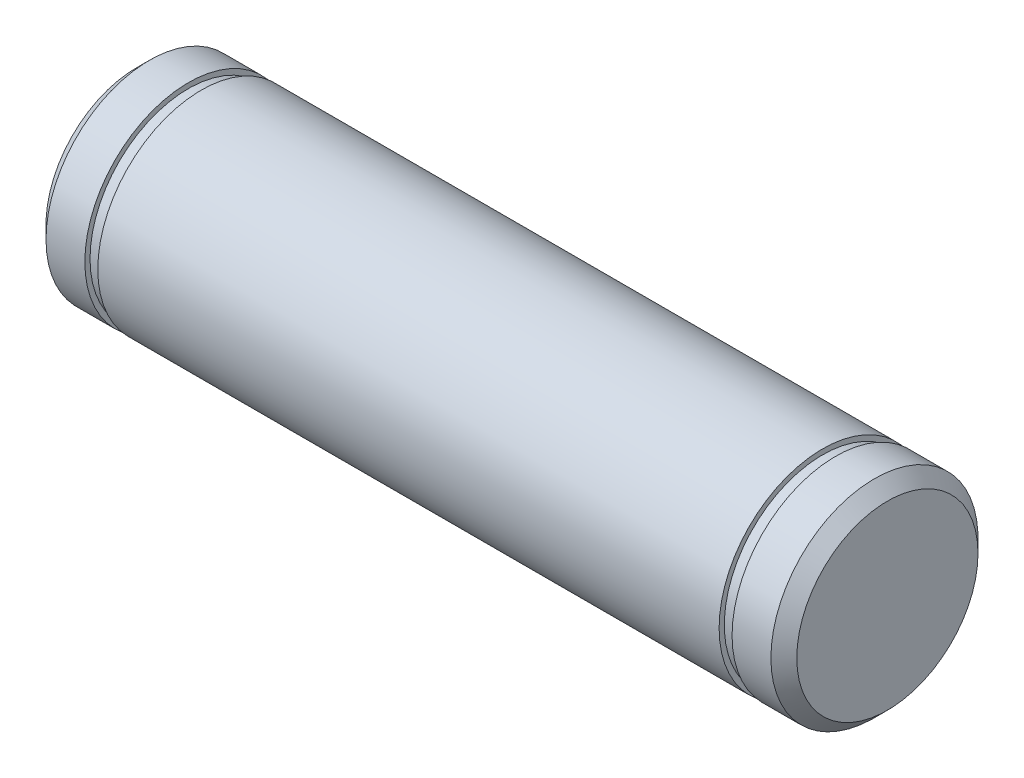
ISO-10303-21;
HEADER;
FILE_DESCRIPTION(('STEP AP214'),'2;1');
FILE_NAME('part.step','',(''),(''),'','','');
FILE_SCHEMA(('AUTOMOTIVE_DESIGN { 1 0 10303 214 1 1 1 1 }'));
ENDSEC;
DATA;
#1=APPLICATION_CONTEXT('core data for automotive mechanical design processes');
#2=APPLICATION_PROTOCOL_DEFINITION('international standard','automotive_design',2000,#1);
#3=PRODUCT_CONTEXT('',#1,'mechanical');
#4=PRODUCT('Part','Part','',(#3));
#5=PRODUCT_RELATED_PRODUCT_CATEGORY('part','',(#4));
#6=PRODUCT_DEFINITION_FORMATION('','',#4);
#7=PRODUCT_DEFINITION_CONTEXT('part definition',#1,'design');
#8=PRODUCT_DEFINITION('design','',#6,#7);
#9=PRODUCT_DEFINITION_SHAPE('','',#8);
#10=(LENGTH_UNIT() NAMED_UNIT(*) SI_UNIT(.MILLI.,.METRE.));
#11=(NAMED_UNIT(*) PLANE_ANGLE_UNIT() SI_UNIT($,.RADIAN.));
#12=(NAMED_UNIT(*) SI_UNIT($,.STERADIAN.) SOLID_ANGLE_UNIT());
#13=UNCERTAINTY_MEASURE_WITH_UNIT(LENGTH_MEASURE(1.E-05),#10,'distance_accuracy_value','');
#14=(GEOMETRIC_REPRESENTATION_CONTEXT(3) GLOBAL_UNCERTAINTY_ASSIGNED_CONTEXT((#13)) GLOBAL_UNIT_ASSIGNED_CONTEXT((#10,
#11,#12)) REPRESENTATION_CONTEXT('',''));
#15=CARTESIAN_POINT('',(0.,0.,0.));
#16=DIRECTION('',(0.,0.,1.));
#17=DIRECTION('',(1.,0.,0.));
#18=AXIS2_PLACEMENT_3D('',#15,#16,#17);
#19=CARTESIAN_POINT('',(14.5,0.,0.));
#20=DIRECTION('',(-1.,0.,0.));
#21=DIRECTION('',(0.,0.,1.));
#22=AXIS2_PLACEMENT_3D('',#19,#20,#21);
#23=CYLINDRICAL_SURFACE('',#22,2.);
#24=CARTESIAN_POINT('',(13.25,0.,0.));
#25=DIRECTION('',(1.,0.,0.));
#26=DIRECTION('',(0.,0.,-1.));
#27=AXIS2_PLACEMENT_3D('',#24,#25,#26);
#28=CIRCLE('',#27,2.);
#29=CARTESIAN_POINT('',(13.25,0.,2.));
#30=VERTEX_POINT('',#29);
#31=EDGE_CURVE('E56',#30,#30,#28,.T.);
#32=CARTESIAN_POINT('',(1.25,0.,0.));
#33=DIRECTION('',(-1.,0.,0.));
#34=DIRECTION('',(0.,0.,1.));
#35=AXIS2_PLACEMENT_3D('',#32,#33,#34);
#36=CIRCLE('',#35,2.);
#37=CARTESIAN_POINT('',(1.25,0.,2.));
#38=VERTEX_POINT('',#37);
#39=EDGE_CURVE('E57',#38,#38,#36,.T.);
#40=CARTESIAN_POINT('',(13.25,0.,2.));
#41=CARTESIAN_POINT('',(13.125,0.,2.));
#42=CARTESIAN_POINT('',(13.,0.,2.));
#43=CARTESIAN_POINT('',(12.75,0.,2.));
#44=CARTESIAN_POINT('',(12.625,0.,2.));
#45=CARTESIAN_POINT('',(12.375,0.,2.));
#46=CARTESIAN_POINT('',(12.25,0.,2.));
#47=CARTESIAN_POINT('',(12.,0.,2.));
#48=CARTESIAN_POINT('',(11.875,0.,2.));
#49=CARTESIAN_POINT('',(11.625,0.,2.));
#50=CARTESIAN_POINT('',(11.5,0.,2.));
#51=CARTESIAN_POINT('',(11.25,0.,2.));
#52=CARTESIAN_POINT('',(11.125,0.,2.));
#53=CARTESIAN_POINT('',(10.875,0.,2.));
#54=CARTESIAN_POINT('',(10.75,0.,2.));
#55=CARTESIAN_POINT('',(10.5,0.,2.));
#56=CARTESIAN_POINT('',(10.375,0.,2.));
#57=CARTESIAN_POINT('',(10.125,0.,2.));
#58=CARTESIAN_POINT('',(10.,0.,2.));
#59=CARTESIAN_POINT('',(9.75,0.,2.));
#60=CARTESIAN_POINT('',(9.625,0.,2.));
#61=CARTESIAN_POINT('',(9.375,0.,2.));
#62=CARTESIAN_POINT('',(9.25,0.,2.));
#63=CARTESIAN_POINT('',(9.,0.,2.));
#64=CARTESIAN_POINT('',(8.875,0.,2.));
#65=CARTESIAN_POINT('',(8.625,0.,2.));
#66=CARTESIAN_POINT('',(8.5,0.,2.));
#67=CARTESIAN_POINT('',(8.25,0.,2.));
#68=CARTESIAN_POINT('',(8.125,0.,2.));
#69=CARTESIAN_POINT('',(7.875,0.,2.));
#70=CARTESIAN_POINT('',(7.75,0.,2.));
#71=CARTESIAN_POINT('',(7.5,0.,2.));
#72=CARTESIAN_POINT('',(7.375,0.,2.));
#73=CARTESIAN_POINT('',(7.125,0.,2.));
#74=CARTESIAN_POINT('',(7.,0.,2.));
#75=CARTESIAN_POINT('',(6.75,0.,2.));
#76=CARTESIAN_POINT('',(6.625,0.,2.));
#77=CARTESIAN_POINT('',(6.375,0.,2.));
#78=CARTESIAN_POINT('',(6.25,0.,2.));
#79=CARTESIAN_POINT('',(6.,0.,2.));
#80=CARTESIAN_POINT('',(5.875,0.,2.));
#81=CARTESIAN_POINT('',(5.625,0.,2.));
#82=CARTESIAN_POINT('',(5.5,0.,2.));
#83=CARTESIAN_POINT('',(5.25,0.,2.));
#84=CARTESIAN_POINT('',(5.125,0.,2.));
#85=CARTESIAN_POINT('',(4.875,0.,2.));
#86=CARTESIAN_POINT('',(4.75,0.,2.));
#87=CARTESIAN_POINT('',(4.5,0.,2.));
#88=CARTESIAN_POINT('',(4.375,0.,2.));
#89=CARTESIAN_POINT('',(4.125,0.,2.));
#90=CARTESIAN_POINT('',(4.,0.,2.));
#91=CARTESIAN_POINT('',(3.75,0.,2.));
#92=CARTESIAN_POINT('',(3.625,0.,2.));
#93=CARTESIAN_POINT('',(3.375,0.,2.));
#94=CARTESIAN_POINT('',(3.25,0.,2.));
#95=CARTESIAN_POINT('',(3.,0.,2.));
#96=CARTESIAN_POINT('',(2.875,0.,2.));
#97=CARTESIAN_POINT('',(2.625,0.,2.));
#98=CARTESIAN_POINT('',(2.5,0.,2.));
#99=CARTESIAN_POINT('',(2.25,0.,2.));
#100=CARTESIAN_POINT('',(2.125,0.,2.));
#101=CARTESIAN_POINT('',(1.875,0.,2.));
#102=CARTESIAN_POINT('',(1.75,0.,2.));
#103=CARTESIAN_POINT('',(1.5,0.,2.));
#104=CARTESIAN_POINT('',(1.375,0.,2.));
#105=CARTESIAN_POINT('',(1.25,0.,2.));
#106=B_SPLINE_CURVE_WITH_KNOTS('',3,(#40,#41,#42,#43,#44,#45,#46,#47,#48,#49,#50,#51,#52,#53,
#54,#55,#56,#57,#58,#59,#60,#61,#62,#63,#64,#65,#66,#67,#68,#69,#70,#71,#72,#73,#74,#75,#76,#77,
#78,#79,#80,#81,#82,#83,#84,#85,#86,#87,#88,#89,#90,#91,#92,#93,#94,#95,#96,#97,#98,#99,#100,
#101,#102,#103,#104,#105),.UNSPECIFIED.,.F.,.F.,(4,2,2,2,2,2,2,2,2,2,2,2,2,2,2,2,2,2,2,2,2,2,2,
2,2,2,2,2,2,2,2,2,4),(0.,0.374999999999999,0.749999999999999,1.125,1.5,1.875,2.25,2.625,3.,
3.375,3.75,4.125,4.5,4.875,5.25,5.625,6.,6.375,6.75,7.125,7.5,7.875,8.25,8.625,9.,9.375,9.75,
10.125,10.5,10.875,11.25,11.625,12.),.UNSPECIFIED.);
#107=EDGE_CURVE('BSEAM36',#30,#38,#106,.T.);
#108=ORIENTED_EDGE('',*,*,#31,.F.);
#109=ORIENTED_EDGE('',*,*,#39,.F.);
#110=ORIENTED_EDGE('',*,*,#107,.T.);
#111=ORIENTED_EDGE('',*,*,#107,.F.);
#112=EDGE_LOOP('',(#108,#110,#109,#111));
#113=FACE_BOUND('',#112,.T.);
#114=ADVANCED_FACE('F36',(#113),#23,.T.);
#115=CARTESIAN_POINT('',(13.25,0.,0.));
#116=DIRECTION('',(1.,0.,0.));
#117=DIRECTION('',(0.,0.,-1.));
#118=AXIS2_PLACEMENT_3D('',#115,#116,#117);
#119=PLANE('',#118);
#120=CARTESIAN_POINT('',(13.25,0.,0.));
#121=DIRECTION('',(1.,0.,0.));
#122=DIRECTION('',(0.,0.,-1.));
#123=AXIS2_PLACEMENT_3D('',#120,#121,#122);
#124=CIRCLE('',#123,1.9);
#125=CARTESIAN_POINT('',(13.25,0.,-1.9));
#126=VERTEX_POINT('',#125);
#127=EDGE_CURVE('E70',#126,#126,#124,.T.);
#128=ORIENTED_EDGE('',*,*,#127,.F.);
#129=EDGE_LOOP('',(#128));
#130=FACE_BOUND('',#129,.T.);
#131=ORIENTED_EDGE('',*,*,#31,.T.);
#132=EDGE_LOOP('',(#131));
#133=FACE_BOUND('',#132,.T.);
#134=ADVANCED_FACE('F93',(#130,#133),#119,.T.);
#135=CARTESIAN_POINT('',(13.5,0.,0.));
#136=DIRECTION('',(1.,0.,0.));
#137=DIRECTION('',(0.,0.,-1.));
#138=AXIS2_PLACEMENT_3D('',#135,#136,#137);
#139=PLANE('',#138);
#140=CARTESIAN_POINT('',(13.5,0.,0.));
#141=DIRECTION('',(1.,0.,0.));
#142=DIRECTION('',(0.,0.,-1.));
#143=AXIS2_PLACEMENT_3D('',#140,#141,#142);
#144=CIRCLE('',#143,1.9);
#145=CARTESIAN_POINT('',(13.5,0.,-1.9));
#146=VERTEX_POINT('',#145);
#147=EDGE_CURVE('E60',#146,#146,#144,.T.);
#148=ORIENTED_EDGE('',*,*,#147,.T.);
#149=EDGE_LOOP('',(#148));
#150=FACE_BOUND('',#149,.T.);
#151=CARTESIAN_POINT('',(13.5,0.,0.));
#152=DIRECTION('',(1.,0.,0.));
#153=DIRECTION('',(0.,0.,-1.));
#154=AXIS2_PLACEMENT_3D('',#151,#152,#153);
#155=CIRCLE('',#154,2.);
#156=CARTESIAN_POINT('',(13.5,0.,2.));
#157=VERTEX_POINT('',#156);
#158=EDGE_CURVE('E67',#157,#157,#155,.T.);
#159=ORIENTED_EDGE('',*,*,#158,.F.);
#160=EDGE_LOOP('',(#159));
#161=FACE_BOUND('',#160,.T.);
#162=ADVANCED_FACE('F100',(#150,#161),#139,.F.);
#163=CARTESIAN_POINT('',(13.25,0.,0.));
#164=DIRECTION('',(1.,0.,0.));
#165=DIRECTION('',(0.,0.,-1.));
#166=AXIS2_PLACEMENT_3D('',#163,#164,#165);
#167=CYLINDRICAL_SURFACE('',#166,1.9);
#168=ORIENTED_EDGE('',*,*,#127,.T.);
#169=EDGE_LOOP('',(#168));
#170=FACE_BOUND('',#169,.T.);
#171=ORIENTED_EDGE('',*,*,#147,.F.);
#172=EDGE_LOOP('',(#171));
#173=FACE_BOUND('',#172,.T.);
#174=ADVANCED_FACE('F114',(#170,#173),#167,.T.);
#175=CARTESIAN_POINT('',(14.5,0.,0.));
#176=DIRECTION('',(1.,0.,0.));
#177=DIRECTION('',(0.,0.,-1.));
#178=AXIS2_PLACEMENT_3D('',#175,#176,#177);
#179=PLANE('',#178);
#180=CARTESIAN_POINT('',(14.5,0.,0.));
#181=DIRECTION('',(1.,0.,0.));
#182=DIRECTION('',(0.,0.,-1.));
#183=AXIS2_PLACEMENT_3D('',#180,#181,#182);
#184=CIRCLE('',#183,1.75000000000001);
#185=CARTESIAN_POINT('',(14.5,0.,-1.75000000000001));
#186=VERTEX_POINT('',#185);
#187=EDGE_CURVE('E51',#186,#186,#184,.T.);
#188=ORIENTED_EDGE('',*,*,#187,.T.);
#189=EDGE_LOOP('',(#188));
#190=FACE_BOUND('',#189,.T.);
#191=ADVANCED_FACE('F109',(#190),#179,.T.);
#192=CARTESIAN_POINT('',(14.25,0.,0.));
#193=DIRECTION('',(1.,0.,0.));
#194=DIRECTION('',(0.,0.,-1.));
#195=AXIS2_PLACEMENT_3D('',#192,#193,#194);
#196=CIRCLE('',#195,2.);
#197=CARTESIAN_POINT('',(14.25,0.,2.));
#198=VERTEX_POINT('',#197);
#199=EDGE_CURVE('E47',#198,#198,#196,.F.);
#200=CARTESIAN_POINT('',(14.25,0.,2.));
#201=CARTESIAN_POINT('',(14.2421875,0.,2.));
#202=CARTESIAN_POINT('',(14.234375,0.,2.));
#203=CARTESIAN_POINT('',(14.21875,0.,2.));
#204=CARTESIAN_POINT('',(14.2109375,0.,2.));
#205=CARTESIAN_POINT('',(14.1953125,0.,2.));
#206=CARTESIAN_POINT('',(14.1875,0.,2.));
#207=CARTESIAN_POINT('',(14.171875,0.,2.));
#208=CARTESIAN_POINT('',(14.1640625,0.,2.));
#209=CARTESIAN_POINT('',(14.1484375,0.,2.));
#210=CARTESIAN_POINT('',(14.140625,0.,2.));
#211=CARTESIAN_POINT('',(14.125,0.,2.));
#212=CARTESIAN_POINT('',(14.1171875,0.,2.));
#213=CARTESIAN_POINT('',(14.1015625,0.,2.));
#214=CARTESIAN_POINT('',(14.09375,0.,2.));
#215=CARTESIAN_POINT('',(14.078125,0.,2.));
#216=CARTESIAN_POINT('',(14.0703125,0.,2.));
#217=CARTESIAN_POINT('',(14.0546875,0.,2.));
#218=CARTESIAN_POINT('',(14.046875,0.,2.));
#219=CARTESIAN_POINT('',(14.03125,0.,2.));
#220=CARTESIAN_POINT('',(14.0234375,0.,2.));
#221=CARTESIAN_POINT('',(14.0078125,0.,2.));
#222=CARTESIAN_POINT('',(14.,0.,2.));
#223=CARTESIAN_POINT('',(13.984375,0.,2.));
#224=CARTESIAN_POINT('',(13.9765625,0.,2.));
#225=CARTESIAN_POINT('',(13.9609375,0.,2.));
#226=CARTESIAN_POINT('',(13.953125,0.,2.));
#227=CARTESIAN_POINT('',(13.9375,0.,2.));
#228=CARTESIAN_POINT('',(13.9296875,0.,2.));
#229=CARTESIAN_POINT('',(13.9140625,0.,2.));
#230=CARTESIAN_POINT('',(13.90625,0.,2.));
#231=CARTESIAN_POINT('',(13.890625,0.,2.));
#232=CARTESIAN_POINT('',(13.8828125,0.,2.));
#233=CARTESIAN_POINT('',(13.8671875,0.,2.));
#234=CARTESIAN_POINT('',(13.859375,0.,2.));
#235=CARTESIAN_POINT('',(13.84375,0.,2.));
#236=CARTESIAN_POINT('',(13.8359375,0.,2.));
#237=CARTESIAN_POINT('',(13.8203125,0.,2.));
#238=CARTESIAN_POINT('',(13.8125,0.,2.));
#239=CARTESIAN_POINT('',(13.796875,0.,2.));
#240=CARTESIAN_POINT('',(13.7890625,0.,2.));
#241=CARTESIAN_POINT('',(13.7734375,0.,2.));
#242=CARTESIAN_POINT('',(13.765625,0.,2.));
#243=CARTESIAN_POINT('',(13.75,0.,2.));
#244=CARTESIAN_POINT('',(13.7421875,0.,2.));
#245=CARTESIAN_POINT('',(13.7265625,0.,2.));
#246=CARTESIAN_POINT('',(13.71875,0.,2.));
#247=CARTESIAN_POINT('',(13.703125,0.,2.));
#248=CARTESIAN_POINT('',(13.6953125,0.,2.));
#249=CARTESIAN_POINT('',(13.6796875,0.,2.));
#250=CARTESIAN_POINT('',(13.671875,0.,2.));
#251=CARTESIAN_POINT('',(13.65625,0.,2.));
#252=CARTESIAN_POINT('',(13.6484375,0.,2.));
#253=CARTESIAN_POINT('',(13.6328125,0.,2.));
#254=CARTESIAN_POINT('',(13.625,0.,2.));
#255=CARTESIAN_POINT('',(13.609375,0.,2.));
#256=CARTESIAN_POINT('',(13.6015625,0.,2.));
#257=CARTESIAN_POINT('',(13.5859375,0.,2.));
#258=CARTESIAN_POINT('',(13.578125,0.,2.));
#259=CARTESIAN_POINT('',(13.5625,0.,2.));
#260=CARTESIAN_POINT('',(13.5546875,0.,2.));
#261=CARTESIAN_POINT('',(13.5390625,0.,2.));
#262=CARTESIAN_POINT('',(13.53125,0.,2.));
#263=CARTESIAN_POINT('',(13.515625,0.,2.));
#264=CARTESIAN_POINT('',(13.5078125,0.,2.));
#265=CARTESIAN_POINT('',(13.5,0.,2.));
#266=B_SPLINE_CURVE_WITH_KNOTS('',3,(#200,#201,#202,#203,#204,#205,#206,#207,#208,#209,#210,
#211,#212,#213,#214,#215,#216,#217,#218,#219,#220,#221,#222,#223,#224,#225,#226,#227,#228,#229,
#230,#231,#232,#233,#234,#235,#236,#237,#238,#239,#240,#241,#242,#243,#244,#245,#246,#247,#248,
#249,#250,#251,#252,#253,#254,#255,#256,#257,#258,#259,#260,#261,#262,#263,#264,#265),
.UNSPECIFIED.,.F.,.F.,(4,2,2,2,2,2,2,2,2,2,2,2,2,2,2,2,2,2,2,2,2,2,2,2,2,2,2,2,2,2,2,2,4),(0.,
0.0234374999999992,0.046875,0.0703124999999992,0.0937500000000001,0.117187500000001,0.140625,
0.164062500000001,0.187500000000002,0.210937500000001,0.234375000000002,0.257812500000001,
0.281250000000002,0.304687500000003,0.328125000000002,0.351562500000003,0.375000000000004,
0.398437500000003,0.421875000000004,0.445312500000005,0.468750000000004,0.492187500000005,
0.515625000000004,0.539062500000005,0.562500000000006,0.585937500000005,0.609375000000006,
0.632812500000007,0.656250000000006,0.679687500000007,0.703125000000006,0.726562500000007,
0.750000000000008),.UNSPECIFIED.);
#267=EDGE_CURVE('BSEAM88',#198,#157,#266,.T.);
#268=ORIENTED_EDGE('',*,*,#199,.T.);
#269=ORIENTED_EDGE('',*,*,#158,.T.);
#270=ORIENTED_EDGE('',*,*,#267,.T.);
#271=ORIENTED_EDGE('',*,*,#267,.F.);
#272=EDGE_LOOP('',(#268,#270,#269,#271));
#273=FACE_BOUND('',#272,.T.);
#274=ADVANCED_FACE('F88',(#273),#23,.T.);
#275=CARTESIAN_POINT('',(1.25,0.,0.));
#276=DIRECTION('',(-1.,0.,0.));
#277=DIRECTION('',(0.,0.,1.));
#278=AXIS2_PLACEMENT_3D('',#275,#276,#277);
#279=PLANE('',#278);
#280=CARTESIAN_POINT('',(1.25,0.,0.));
#281=DIRECTION('',(-1.,0.,0.));
#282=DIRECTION('',(0.,0.,1.));
#283=AXIS2_PLACEMENT_3D('',#280,#281,#282);
#284=CIRCLE('',#283,1.9);
#285=CARTESIAN_POINT('',(1.25,0.,1.9));
#286=VERTEX_POINT('',#285);
#287=EDGE_CURVE('E64',#286,#286,#284,.T.);
#288=ORIENTED_EDGE('',*,*,#287,.F.);
#289=EDGE_LOOP('',(#288));
#290=FACE_BOUND('',#289,.T.);
#291=ORIENTED_EDGE('',*,*,#39,.T.);
#292=EDGE_LOOP('',(#291));
#293=FACE_BOUND('',#292,.T.);
#294=ADVANCED_FACE('F84',(#290,#293),#279,.T.);
#295=CARTESIAN_POINT('',(1.,0.,0.));
#296=DIRECTION('',(-1.,0.,0.));
#297=DIRECTION('',(0.,0.,1.));
#298=AXIS2_PLACEMENT_3D('',#295,#296,#297);
#299=PLANE('',#298);
#300=CARTESIAN_POINT('',(1.,0.,0.));
#301=DIRECTION('',(-1.,0.,0.));
#302=DIRECTION('',(0.,0.,1.));
#303=AXIS2_PLACEMENT_3D('',#300,#301,#302);
#304=CIRCLE('',#303,1.9);
#305=CARTESIAN_POINT('',(1.,0.,1.9));
#306=VERTEX_POINT('',#305);
#307=EDGE_CURVE('E75',#306,#306,#304,.T.);
#308=ORIENTED_EDGE('',*,*,#307,.T.);
#309=EDGE_LOOP('',(#308));
#310=FACE_BOUND('',#309,.T.);
#311=CARTESIAN_POINT('',(0.999999999999999,0.,0.));
#312=DIRECTION('',(-1.,0.,0.));
#313=DIRECTION('',(0.,0.,1.));
#314=AXIS2_PLACEMENT_3D('',#311,#312,#313);
#315=CIRCLE('',#314,2.);
#316=CARTESIAN_POINT('',(1.,0.,2.));
#317=VERTEX_POINT('',#316);
#318=EDGE_CURVE('E61',#317,#317,#315,.T.);
#319=ORIENTED_EDGE('',*,*,#318,.F.);
#320=EDGE_LOOP('',(#319));
#321=FACE_BOUND('',#320,.T.);
#322=ADVANCED_FACE('F87',(#310,#321),#299,.F.);
#323=CARTESIAN_POINT('',(1.25,0.,0.));
#324=DIRECTION('',(-1.,0.,0.));
#325=DIRECTION('',(0.,0.,1.));
#326=AXIS2_PLACEMENT_3D('',#323,#324,#325);
#327=CYLINDRICAL_SURFACE('',#326,1.9);
#328=ORIENTED_EDGE('',*,*,#287,.T.);
#329=EDGE_LOOP('',(#328));
#330=FACE_BOUND('',#329,.T.);
#331=ORIENTED_EDGE('',*,*,#307,.F.);
#332=EDGE_LOOP('',(#331));
#333=FACE_BOUND('',#332,.T.);
#334=ADVANCED_FACE('F81',(#330,#333),#327,.T.);
#335=CARTESIAN_POINT('',(0.,0.,0.));
#336=DIRECTION('',(1.,0.,0.));
#337=DIRECTION('',(0.,0.,-1.));
#338=AXIS2_PLACEMENT_3D('',#335,#336,#337);
#339=PLANE('',#338);
#340=CARTESIAN_POINT('',(0.,0.,0.));
#341=DIRECTION('',(1.,0.,0.));
#342=DIRECTION('',(0.,0.,-1.));
#343=AXIS2_PLACEMENT_3D('',#340,#341,#342);
#344=CIRCLE('',#343,1.74999999999998);
#345=CARTESIAN_POINT('',(0.,0.,-1.74999999999998));
#346=VERTEX_POINT('',#345);
#347=EDGE_CURVE('E10',#346,#346,#344,.F.);
#348=ORIENTED_EDGE('',*,*,#347,.T.);
#349=EDGE_LOOP('',(#348));
#350=FACE_BOUND('',#349,.T.);
#351=ADVANCED_FACE('F107',(#350),#339,.F.);
#352=CARTESIAN_POINT('',(0.250000000000014,0.,0.));
#353=DIRECTION('',(1.,0.,0.));
#354=DIRECTION('',(0.,0.,-1.));
#355=AXIS2_PLACEMENT_3D('',#352,#353,#354);
#356=CIRCLE('',#355,2.);
#357=CARTESIAN_POINT('',(0.250000000000014,0.,2.));
#358=VERTEX_POINT('',#357);
#359=EDGE_CURVE('E43',#358,#358,#356,.T.);
#360=CARTESIAN_POINT('',(0.250000000000014,0.,2.));
#361=CARTESIAN_POINT('',(0.257812500000014,0.,2.));
#362=CARTESIAN_POINT('',(0.265625000000014,0.,2.));
#363=CARTESIAN_POINT('',(0.281250000000013,0.,2.));
#364=CARTESIAN_POINT('',(0.289062500000013,0.,2.));
#365=CARTESIAN_POINT('',(0.304687500000013,0.,2.));
#366=CARTESIAN_POINT('',(0.312500000000013,0.,2.));
#367=CARTESIAN_POINT('',(0.328125000000013,0.,2.));
#368=CARTESIAN_POINT('',(0.335937500000013,0.,2.));
#369=CARTESIAN_POINT('',(0.351562500000012,0.,2.));
#370=CARTESIAN_POINT('',(0.359375000000012,0.,2.));
#371=CARTESIAN_POINT('',(0.375000000000012,0.,2.));
#372=CARTESIAN_POINT('',(0.382812500000012,0.,2.));
#373=CARTESIAN_POINT('',(0.398437500000012,0.,2.));
#374=CARTESIAN_POINT('',(0.406250000000012,0.,2.));
#375=CARTESIAN_POINT('',(0.421875000000011,0.,2.));
#376=CARTESIAN_POINT('',(0.429687500000011,0.,2.));
#377=CARTESIAN_POINT('',(0.445312500000011,0.,2.));
#378=CARTESIAN_POINT('',(0.45312500000001,0.,2.));
#379=CARTESIAN_POINT('',(0.46875000000001,0.,2.));
#380=CARTESIAN_POINT('',(0.476562500000009,0.,2.));
#381=CARTESIAN_POINT('',(0.492187500000009,0.,2.));
#382=CARTESIAN_POINT('',(0.50000000000001,0.,2.));
#383=CARTESIAN_POINT('',(0.51562500000001,0.,2.));
#384=CARTESIAN_POINT('',(0.523437500000009,0.,2.));
#385=CARTESIAN_POINT('',(0.539062500000009,0.,2.));
#386=CARTESIAN_POINT('',(0.546875000000009,0.,2.));
#387=CARTESIAN_POINT('',(0.562500000000009,0.,2.));
#388=CARTESIAN_POINT('',(0.570312500000009,0.,2.));
#389=CARTESIAN_POINT('',(0.585937500000009,0.,2.));
#390=CARTESIAN_POINT('',(0.593750000000009,0.,2.));
#391=CARTESIAN_POINT('',(0.609375000000008,0.,2.));
#392=CARTESIAN_POINT('',(0.617187500000008,0.,2.));
#393=CARTESIAN_POINT('',(0.632812500000007,0.,2.));
#394=CARTESIAN_POINT('',(0.640625000000007,0.,2.));
#395=CARTESIAN_POINT('',(0.656250000000006,0.,2.));
#396=CARTESIAN_POINT('',(0.664062500000006,0.,2.));
#397=CARTESIAN_POINT('',(0.679687500000006,0.,2.));
#398=CARTESIAN_POINT('',(0.687500000000006,0.,2.));
#399=CARTESIAN_POINT('',(0.703125000000006,0.,2.));
#400=CARTESIAN_POINT('',(0.710937500000006,0.,2.));
#401=CARTESIAN_POINT('',(0.726562500000006,0.,2.));
#402=CARTESIAN_POINT('',(0.734375000000005,0.,2.));
#403=CARTESIAN_POINT('',(0.750000000000005,0.,2.));
#404=CARTESIAN_POINT('',(0.757812500000006,0.,2.));
#405=CARTESIAN_POINT('',(0.773437500000006,0.,2.));
#406=CARTESIAN_POINT('',(0.781250000000005,0.,2.));
#407=CARTESIAN_POINT('',(0.796875000000005,0.,2.));
#408=CARTESIAN_POINT('',(0.804687500000005,0.,2.));
#409=CARTESIAN_POINT('',(0.820312500000004,0.,2.));
#410=CARTESIAN_POINT('',(0.828125000000004,0.,2.));
#411=CARTESIAN_POINT('',(0.843750000000003,0.,2.));
#412=CARTESIAN_POINT('',(0.851562500000003,0.,2.));
#413=CARTESIAN_POINT('',(0.867187500000003,0.,2.));
#414=CARTESIAN_POINT('',(0.875000000000003,0.,2.));
#415=CARTESIAN_POINT('',(0.890625000000003,0.,2.));
#416=CARTESIAN_POINT('',(0.898437500000003,0.,2.));
#417=CARTESIAN_POINT('',(0.914062500000002,0.,2.));
#418=CARTESIAN_POINT('',(0.921875000000002,0.,2.));
#419=CARTESIAN_POINT('',(0.937500000000002,0.,2.));
#420=CARTESIAN_POINT('',(0.945312500000002,0.,2.));
#421=CARTESIAN_POINT('',(0.960937500000002,0.,2.));
#422=CARTESIAN_POINT('',(0.968750000000002,0.,2.));
#423=CARTESIAN_POINT('',(0.984375000000002,0.,2.));
#424=CARTESIAN_POINT('',(0.992187500000001,0.,2.));
#425=CARTESIAN_POINT('',(1.,0.,2.));
#426=B_SPLINE_CURVE_WITH_KNOTS('',3,(#360,#361,#362,#363,#364,#365,#366,#367,#368,#369,#370,
#371,#372,#373,#374,#375,#376,#377,#378,#379,#380,#381,#382,#383,#384,#385,#386,#387,#388,#389,
#390,#391,#392,#393,#394,#395,#396,#397,#398,#399,#400,#401,#402,#403,#404,#405,#406,#407,#408,
#409,#410,#411,#412,#413,#414,#415,#416,#417,#418,#419,#420,#421,#422,#423,#424,#425),
.UNSPECIFIED.,.F.,.F.,(4,2,2,2,2,2,2,2,2,2,2,2,2,2,2,2,2,2,2,2,2,2,2,2,2,2,2,2,2,2,2,2,4),(0.,
0.0234374999999992,0.0468749999999983,0.0703124999999992,0.0937499999999983,0.117187499999998,
0.140624999999998,0.164062499999998,0.187499999999997,0.210937499999996,0.234374999999995,
0.257812499999996,0.281249999999995,0.304687499999994,0.328124999999995,0.351562499999994,
0.374999999999993,0.398437499999993,0.421874999999992,0.445312499999993,0.468749999999992,
0.492187499999991,0.515624999999992,0.539062499999991,0.56249999999999,0.585937499999989,
0.609374999999988,0.632812499999989,0.656249999999988,0.679687499999988,0.703124999999988,
0.726562499999988,0.749999999999987),.UNSPECIFIED.);
#427=EDGE_CURVE('BSEAM96',#358,#317,#426,.T.);
#428=ORIENTED_EDGE('',*,*,#359,.T.);
#429=ORIENTED_EDGE('',*,*,#318,.T.);
#430=ORIENTED_EDGE('',*,*,#427,.T.);
#431=ORIENTED_EDGE('',*,*,#427,.F.);
#432=EDGE_LOOP('',(#428,#430,#429,#431));
#433=FACE_BOUND('',#432,.T.);
#434=ADVANCED_FACE('F96',(#433),#23,.T.);
#435=CARTESIAN_POINT('',(14.5,0.,0.));
#436=DIRECTION('',(-1.,0.,0.));
#437=DIRECTION('',(0.,0.,1.));
#438=AXIS2_PLACEMENT_3D('',#435,#436,#437);
#439=CONICAL_SURFACE('',#438,1.75000000000001,0.785398163397446);
#440=ORIENTED_EDGE('',*,*,#199,.F.);
#441=EDGE_LOOP('',(#440));
#442=FACE_BOUND('',#441,.T.);
#443=ORIENTED_EDGE('',*,*,#187,.F.);
#444=EDGE_LOOP('',(#443));
#445=FACE_BOUND('',#444,.T.);
#446=ADVANCED_FACE('F106',(#442,#445),#439,.T.);
#447=CARTESIAN_POINT('',(0.250000000000014,0.,0.));
#448=DIRECTION('',(1.,0.,0.));
#449=DIRECTION('',(0.,0.,-1.));
#450=AXIS2_PLACEMENT_3D('',#447,#448,#449);
#451=CONICAL_SURFACE('',#450,2.,0.785398163397453);
#452=ORIENTED_EDGE('',*,*,#347,.F.);
#453=EDGE_LOOP('',(#452));
#454=FACE_BOUND('',#453,.T.);
#455=ORIENTED_EDGE('',*,*,#359,.F.);
#456=EDGE_LOOP('',(#455));
#457=FACE_BOUND('',#456,.T.);
#458=ADVANCED_FACE('F38',(#454,#457),#451,.T.);
#459=CLOSED_SHELL('',(#114,#134,#162,#174,#191,#274,#294,#322,#334,#351,#434,#446,#458));
#460=MANIFOLD_SOLID_BREP('B2',#459);
#461=ADVANCED_BREP_SHAPE_REPRESENTATION('',(#18,#460),#14);
#462=SHAPE_DEFINITION_REPRESENTATION(#9,#461);
ENDSEC;
END-ISO-10303-21;
